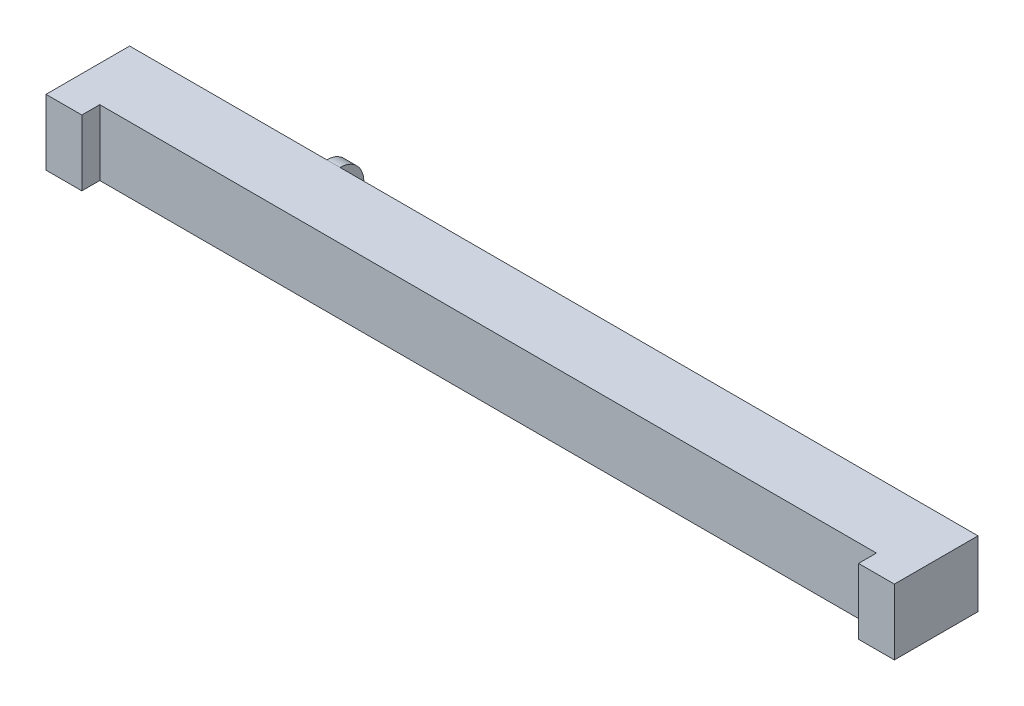
ISO-10303-21;
HEADER;
FILE_DESCRIPTION(('STEP AP214'),'2;1');
FILE_NAME('part.step','',(''),(''),'','','');
FILE_SCHEMA(('AUTOMOTIVE_DESIGN { 1 0 10303 214 1 1 1 1 }'));
ENDSEC;
DATA;
#1=APPLICATION_CONTEXT('core data for automotive mechanical design processes');
#2=APPLICATION_PROTOCOL_DEFINITION('international standard','automotive_design',2000,#1);
#3=PRODUCT_CONTEXT('',#1,'mechanical');
#4=PRODUCT('Part','Part','',(#3));
#5=PRODUCT_RELATED_PRODUCT_CATEGORY('part','',(#4));
#6=PRODUCT_DEFINITION_FORMATION('','',#4);
#7=PRODUCT_DEFINITION_CONTEXT('part definition',#1,'design');
#8=PRODUCT_DEFINITION('design','',#6,#7);
#9=PRODUCT_DEFINITION_SHAPE('','',#8);
#10=(LENGTH_UNIT() NAMED_UNIT(*) SI_UNIT(.MILLI.,.METRE.));
#11=(NAMED_UNIT(*) PLANE_ANGLE_UNIT() SI_UNIT($,.RADIAN.));
#12=(NAMED_UNIT(*) SI_UNIT($,.STERADIAN.) SOLID_ANGLE_UNIT());
#13=UNCERTAINTY_MEASURE_WITH_UNIT(LENGTH_MEASURE(1.E-05),#10,'distance_accuracy_value','');
#14=(GEOMETRIC_REPRESENTATION_CONTEXT(3) GLOBAL_UNCERTAINTY_ASSIGNED_CONTEXT((#13)) GLOBAL_UNIT_ASSIGNED_CONTEXT((#10,
#11,#12)) REPRESENTATION_CONTEXT('',''));
#15=CARTESIAN_POINT('',(0.,0.,0.));
#16=DIRECTION('',(0.,0.,1.));
#17=DIRECTION('',(1.,0.,0.));
#18=AXIS2_PLACEMENT_3D('',#15,#16,#17);
#19=CARTESIAN_POINT('',(-31.5,-63.0317380372777,-3.5));
#20=DIRECTION('',(-1.,0.,0.));
#21=DIRECTION('',(0.,0.,1.));
#22=AXIS2_PLACEMENT_3D('',#19,#20,#21);
#23=PLANE('',#22);
#24=DIRECTION('',(0.,1.,0.));
#25=VECTOR('',#24,1.);
#26=CARTESIAN_POINT('',(-31.5,-63.0317380372777,-3.5));
#27=LINE('',#26,#25);
#28=CARTESIAN_POINT('',(-31.5,0.,-3.5));
#29=VERTEX_POINT('',#28);
#30=CARTESIAN_POINT('',(-31.5,2.6,-3.5));
#31=VERTEX_POINT('',#30);
#32=EDGE_CURVE('E250',#29,#31,#27,.T.);
#33=ORIENTED_EDGE('',*,*,#32,.T.);
#34=DIRECTION('',(0.,0.,1.));
#35=VECTOR('',#34,1.);
#36=CARTESIAN_POINT('',(-31.5,2.6,-5.5));
#37=LINE('',#36,#35);
#38=CARTESIAN_POINT('',(-31.5,2.6,-5.5));
#39=VERTEX_POINT('',#38);
#40=EDGE_CURVE('E384',#39,#31,#37,.T.);
#41=ORIENTED_EDGE('',*,*,#40,.F.);
#42=DIRECTION('',(0.,1.,0.));
#43=VECTOR('',#42,1.);
#44=CARTESIAN_POINT('',(-31.5,-63.0317380372777,-5.5));
#45=LINE('',#44,#43);
#46=CARTESIAN_POINT('',(-31.5,0.,-5.5));
#47=VERTEX_POINT('',#46);
#48=EDGE_CURVE('E376',#47,#39,#45,.T.);
#49=ORIENTED_EDGE('',*,*,#48,.F.);
#50=DIRECTION('',(0.,0.,-1.));
#51=VECTOR('',#50,1.);
#52=CARTESIAN_POINT('',(-31.5,0.,-3.5));
#53=LINE('',#52,#51);
#54=EDGE_CURVE('E249',#29,#47,#53,.T.);
#55=ORIENTED_EDGE('',*,*,#54,.F.);
#56=EDGE_LOOP('',(#33,#41,#49,#55));
#57=FACE_BOUND('',#56,.T.);
#58=ADVANCED_FACE('F43',(#57),#23,.T.);
#59=CARTESIAN_POINT('',(-35.5,5.5,-3.5));
#60=DIRECTION('',(0.,0.,1.));
#61=DIRECTION('',(1.,0.,0.));
#62=AXIS2_PLACEMENT_3D('',#59,#60,#61);
#63=PLANE('',#62);
#64=DIRECTION('',(0.,1.,0.));
#65=VECTOR('',#64,1.);
#66=CARTESIAN_POINT('',(-34.670728733258,4.93410987982223,-3.5));
#67=LINE('',#66,#65);
#68=CARTESIAN_POINT('',(-34.670728733258,3.13346972287778,-3.5));
#69=VERTEX_POINT('',#68);
#70=CARTESIAN_POINT('',(-34.670728733258,4.93410987982223,-3.5));
#71=VERTEX_POINT('',#70);
#72=EDGE_CURVE('E690',#69,#71,#67,.T.);
#73=ORIENTED_EDGE('',*,*,#72,.F.);
#74=DIRECTION('',(-1.,0.,0.));
#75=VECTOR('',#74,1.);
#76=CARTESIAN_POINT('',(-34.670728733258,3.13346972287778,-3.5));
#77=LINE('',#76,#75);
#78=CARTESIAN_POINT('',(-19.,3.13346972287778,-3.5));
#79=VERTEX_POINT('',#78);
#80=EDGE_CURVE('E697',#79,#69,#77,.T.);
#81=ORIENTED_EDGE('',*,*,#80,.F.);
#82=DIRECTION('',(0.,1.,0.));
#83=VECTOR('',#82,1.);
#84=CARTESIAN_POINT('',(-19.,2.6,-3.5));
#85=LINE('',#84,#83);
#86=CARTESIAN_POINT('',(-19.,2.6,-3.5));
#87=VERTEX_POINT('',#86);
#88=EDGE_CURVE('E389',#87,#79,#85,.T.);
#89=ORIENTED_EDGE('',*,*,#88,.F.);
#90=DIRECTION('',(1.,0.,0.));
#91=VECTOR('',#90,1.);
#92=CARTESIAN_POINT('',(-31.5,2.6,-3.5));
#93=LINE('',#92,#91);
#94=EDGE_CURVE('E386',#31,#87,#93,.T.);
#95=ORIENTED_EDGE('',*,*,#94,.F.);
#96=ORIENTED_EDGE('',*,*,#32,.F.);
#97=DIRECTION('',(-1.,0.,0.));
#98=VECTOR('',#97,1.);
#99=CARTESIAN_POINT('',(-35.5,0.,-3.5));
#100=LINE('',#99,#98);
#101=CARTESIAN_POINT('',(-35.5,0.,-3.5));
#102=VERTEX_POINT('',#101);
#103=EDGE_CURVE('E312',#29,#102,#100,.T.);
#104=ORIENTED_EDGE('',*,*,#103,.T.);
#105=DIRECTION('',(0.,-1.,0.));
#106=VECTOR('',#105,1.);
#107=CARTESIAN_POINT('',(-35.5,5.5,-3.5));
#108=LINE('',#107,#106);
#109=CARTESIAN_POINT('',(-35.5,5.5,-3.5));
#110=VERTEX_POINT('',#109);
#111=EDGE_CURVE('E287',#110,#102,#108,.T.);
#112=ORIENTED_EDGE('',*,*,#111,.F.);
#113=DIRECTION('',(-1.,0.,0.));
#114=VECTOR('',#113,1.);
#115=CARTESIAN_POINT('',(-35.5,5.5,-3.5));
#116=LINE('',#115,#114);
#117=CARTESIAN_POINT('',(-19.,5.5,-3.5));
#118=VERTEX_POINT('',#117);
#119=EDGE_CURVE('E277',#118,#110,#116,.T.);
#120=ORIENTED_EDGE('',*,*,#119,.F.);
#121=CARTESIAN_POINT('',(-19.,4.93410987982222,-3.5));
#122=VERTEX_POINT('',#121);
#123=EDGE_CURVE('E284',#122,#118,#85,.T.);
#124=ORIENTED_EDGE('',*,*,#123,.F.);
#125=DIRECTION('',(1.,0.,0.));
#126=VECTOR('',#125,1.);
#127=CARTESIAN_POINT('',(-34.670728733258,4.93410987982223,-3.5));
#128=LINE('',#127,#126);
#129=EDGE_CURVE('E66',#71,#122,#128,.T.);
#130=ORIENTED_EDGE('',*,*,#129,.F.);
#131=EDGE_LOOP('',(#73,#81,#89,#95,#96,#104,#112,#120,#124,#130));
#132=FACE_BOUND('',#131,.T.);
#133=ADVANCED_FACE('F283',(#132),#63,.F.);
#134=CARTESIAN_POINT('',(-35.5,5.5,3.5));
#135=DIRECTION('',(0.,0.,-1.));
#136=DIRECTION('',(-1.,0.,0.));
#137=AXIS2_PLACEMENT_3D('',#134,#135,#136);
#138=PLANE('',#137);
#139=DIRECTION('',(1.,0.,0.));
#140=VECTOR('',#139,1.);
#141=CARTESIAN_POINT('',(-35.5,5.5,3.5));
#142=LINE('',#141,#140);
#143=CARTESIAN_POINT('',(32.5,5.5,3.5));
#144=VERTEX_POINT('',#143);
#145=CARTESIAN_POINT('',(35.5,5.5,3.5));
#146=VERTEX_POINT('',#145);
#147=EDGE_CURVE('E354',#144,#146,#142,.T.);
#148=ORIENTED_EDGE('',*,*,#147,.F.);
#149=DIRECTION('',(0.,-1.,0.));
#150=VECTOR('',#149,1.);
#151=CARTESIAN_POINT('',(32.5,5.5,3.5));
#152=LINE('',#151,#150);
#153=CARTESIAN_POINT('',(32.5,0.,3.5));
#154=VERTEX_POINT('',#153);
#155=EDGE_CURVE('E306',#144,#154,#152,.T.);
#156=ORIENTED_EDGE('',*,*,#155,.T.);
#157=DIRECTION('',(1.,0.,0.));
#158=VECTOR('',#157,1.);
#159=CARTESIAN_POINT('',(-35.5,0.,3.5));
#160=LINE('',#159,#158);
#161=CARTESIAN_POINT('',(35.5,0.,3.5));
#162=VERTEX_POINT('',#161);
#163=EDGE_CURVE('E305',#154,#162,#160,.T.);
#164=ORIENTED_EDGE('',*,*,#163,.T.);
#165=DIRECTION('',(0.,-1.,0.));
#166=VECTOR('',#165,1.);
#167=CARTESIAN_POINT('',(35.5,5.5,3.5));
#168=LINE('',#167,#166);
#169=EDGE_CURVE('E332',#146,#162,#168,.T.);
#170=ORIENTED_EDGE('',*,*,#169,.F.);
#171=EDGE_LOOP('',(#148,#156,#164,#170));
#172=FACE_BOUND('',#171,.T.);
#173=ADVANCED_FACE('F430',(#172),#138,.F.);
#174=CARTESIAN_POINT('',(-35.5,5.5,-3.5));
#175=DIRECTION('',(1.,0.,0.));
#176=DIRECTION('',(0.,0.,-1.));
#177=AXIS2_PLACEMENT_3D('',#174,#175,#176);
#178=PLANE('',#177);
#179=DIRECTION('',(0.,0.,1.));
#180=VECTOR('',#179,1.);
#181=CARTESIAN_POINT('',(-35.5,0.,-3.5));
#182=LINE('',#181,#180);
#183=CARTESIAN_POINT('',(-35.5,0.,3.5));
#184=VERTEX_POINT('',#183);
#185=EDGE_CURVE('E301',#102,#184,#182,.T.);
#186=ORIENTED_EDGE('',*,*,#185,.T.);
#187=DIRECTION('',(0.,-1.,0.));
#188=VECTOR('',#187,1.);
#189=CARTESIAN_POINT('',(-35.5,5.5,3.5));
#190=LINE('',#189,#188);
#191=CARTESIAN_POINT('',(-35.5,5.5,3.5));
#192=VERTEX_POINT('',#191);
#193=EDGE_CURVE('E329',#192,#184,#190,.T.);
#194=ORIENTED_EDGE('',*,*,#193,.F.);
#195=DIRECTION('',(0.,0.,1.));
#196=VECTOR('',#195,1.);
#197=CARTESIAN_POINT('',(-35.5,5.5,-3.5));
#198=LINE('',#197,#196);
#199=EDGE_CURVE('E320',#110,#192,#198,.T.);
#200=ORIENTED_EDGE('',*,*,#199,.F.);
#201=ORIENTED_EDGE('',*,*,#111,.T.);
#202=EDGE_LOOP('',(#186,#194,#200,#201));
#203=FACE_BOUND('',#202,.T.);
#204=ADVANCED_FACE('F340',(#203),#178,.F.);
#205=CARTESIAN_POINT('',(-32.5,0.,3.5));
#206=VERTEX_POINT('',#205);
#207=EDGE_CURVE('E307',#184,#206,#160,.T.);
#208=ORIENTED_EDGE('',*,*,#207,.T.);
#209=DIRECTION('',(0.,1.,0.));
#210=VECTOR('',#209,1.);
#211=CARTESIAN_POINT('',(-32.5,5.5,3.5));
#212=LINE('',#211,#210);
#213=CARTESIAN_POINT('',(-32.5,5.5,3.5));
#214=VERTEX_POINT('',#213);
#215=EDGE_CURVE('E352',#206,#214,#212,.T.);
#216=ORIENTED_EDGE('',*,*,#215,.T.);
#217=EDGE_CURVE('E292',#192,#214,#142,.T.);
#218=ORIENTED_EDGE('',*,*,#217,.F.);
#219=ORIENTED_EDGE('',*,*,#193,.T.);
#220=EDGE_LOOP('',(#208,#216,#218,#219));
#221=FACE_BOUND('',#220,.T.);
#222=ADVANCED_FACE('F350',(#221),#138,.F.);
#223=CARTESIAN_POINT('',(35.5,5.5,-3.5));
#224=DIRECTION('',(-1.,0.,0.));
#225=DIRECTION('',(0.,0.,1.));
#226=AXIS2_PLACEMENT_3D('',#223,#224,#225);
#227=PLANE('',#226);
#228=DIRECTION('',(0.,0.,-1.));
#229=VECTOR('',#228,1.);
#230=CARTESIAN_POINT('',(35.5,0.,-3.5));
#231=LINE('',#230,#229);
#232=CARTESIAN_POINT('',(35.5,0.,-3.5));
#233=VERTEX_POINT('',#232);
#234=EDGE_CURVE('E310',#162,#233,#231,.T.);
#235=ORIENTED_EDGE('',*,*,#234,.T.);
#236=DIRECTION('',(0.,-1.,0.));
#237=VECTOR('',#236,1.);
#238=CARTESIAN_POINT('',(35.5,5.5,-3.5));
#239=LINE('',#238,#237);
#240=CARTESIAN_POINT('',(35.5,5.5,-3.5));
#241=VERTEX_POINT('',#240);
#242=EDGE_CURVE('E334',#241,#233,#239,.T.);
#243=ORIENTED_EDGE('',*,*,#242,.F.);
#244=DIRECTION('',(0.,0.,-1.));
#245=VECTOR('',#244,1.);
#246=CARTESIAN_POINT('',(35.5,5.5,-3.5));
#247=LINE('',#246,#245);
#248=EDGE_CURVE('E289',#146,#241,#247,.T.);
#249=ORIENTED_EDGE('',*,*,#248,.F.);
#250=ORIENTED_EDGE('',*,*,#169,.T.);
#251=EDGE_LOOP('',(#235,#243,#249,#250));
#252=FACE_BOUND('',#251,.T.);
#253=ADVANCED_FACE('F425',(#252),#227,.F.);
#254=DIRECTION('',(0.,1.,0.));
#255=VECTOR('',#254,1.);
#256=CARTESIAN_POINT('',(-17.9,2.6,-3.5));
#257=LINE('',#256,#255);
#258=CARTESIAN_POINT('',(-17.9,2.6,-3.5));
#259=VERTEX_POINT('',#258);
#260=CARTESIAN_POINT('',(-17.9,3.13346972287778,-3.5));
#261=VERTEX_POINT('',#260);
#262=EDGE_CURVE('E231',#259,#261,#257,.T.);
#263=ORIENTED_EDGE('',*,*,#262,.T.);
#264=DIRECTION('',(-1.,0.,0.));
#265=VECTOR('',#264,1.);
#266=CARTESIAN_POINT('',(-17.9,3.13346972287779,-3.5));
#267=LINE('',#266,#265);
#268=CARTESIAN_POINT('',(34.747146170088,3.13346972287778,-3.5));
#269=VERTEX_POINT('',#268);
#270=EDGE_CURVE('E58',#269,#261,#267,.T.);
#271=ORIENTED_EDGE('',*,*,#270,.F.);
#272=DIRECTION('',(0.,-1.,0.));
#273=VECTOR('',#272,1.);
#274=CARTESIAN_POINT('',(34.747146170088,4.93410987982223,-3.5));
#275=LINE('',#274,#273);
#276=CARTESIAN_POINT('',(34.747146170088,4.93410987982223,-3.5));
#277=VERTEX_POINT('',#276);
#278=EDGE_CURVE('E225',#277,#269,#275,.T.);
#279=ORIENTED_EDGE('',*,*,#278,.F.);
#280=DIRECTION('',(1.,0.,0.));
#281=VECTOR('',#280,1.);
#282=CARTESIAN_POINT('',(-17.9,4.93410987982223,-3.5));
#283=LINE('',#282,#281);
#284=CARTESIAN_POINT('',(-17.9,4.93410987982223,-3.5));
#285=VERTEX_POINT('',#284);
#286=EDGE_CURVE('E204',#285,#277,#283,.T.);
#287=ORIENTED_EDGE('',*,*,#286,.F.);
#288=CARTESIAN_POINT('',(-17.9,5.5,-3.5));
#289=VERTEX_POINT('',#288);
#290=EDGE_CURVE('E223',#285,#289,#257,.T.);
#291=ORIENTED_EDGE('',*,*,#290,.T.);
#292=EDGE_CURVE('E279',#241,#289,#116,.T.);
#293=ORIENTED_EDGE('',*,*,#292,.F.);
#294=ORIENTED_EDGE('',*,*,#242,.T.);
#295=CARTESIAN_POINT('',(31.5,0.,-3.5));
#296=VERTEX_POINT('',#295);
#297=EDGE_CURVE('E318',#233,#296,#100,.T.);
#298=ORIENTED_EDGE('',*,*,#297,.T.);
#299=DIRECTION('',(0.,1.,0.));
#300=VECTOR('',#299,1.);
#301=CARTESIAN_POINT('',(31.5,-63.0317380372777,-3.5));
#302=LINE('',#301,#300);
#303=CARTESIAN_POINT('',(31.5,2.6,-3.5));
#304=VERTEX_POINT('',#303);
#305=EDGE_CURVE('E245',#296,#304,#302,.T.);
#306=ORIENTED_EDGE('',*,*,#305,.T.);
#307=DIRECTION('',(1.,0.,0.));
#308=VECTOR('',#307,1.);
#309=CARTESIAN_POINT('',(31.5,2.6,-3.5));
#310=LINE('',#309,#308);
#311=EDGE_CURVE('E235',#259,#304,#310,.T.);
#312=ORIENTED_EDGE('',*,*,#311,.F.);
#313=EDGE_LOOP('',(#263,#271,#279,#287,#291,#293,#294,#298,#306,#312));
#314=FACE_BOUND('',#313,.T.);
#315=ADVANCED_FACE('F221',(#314),#63,.F.);
#316=CARTESIAN_POINT('',(-35.5,5.5,3.5));
#317=DIRECTION('',(0.,1.,0.));
#318=DIRECTION('',(0.,0.,1.));
#319=AXIS2_PLACEMENT_3D('',#316,#317,#318);
#320=PLANE('',#319);
#321=ORIENTED_EDGE('',*,*,#292,.T.);
#322=DIRECTION('',(-1.,0.,0.));
#323=VECTOR('',#322,1.);
#324=CARTESIAN_POINT('',(-35.5,5.5,-3.5));
#325=LINE('',#324,#323);
#326=EDGE_CURVE('E253',#289,#118,#325,.T.);
#327=ORIENTED_EDGE('',*,*,#326,.T.);
#328=ORIENTED_EDGE('',*,*,#119,.T.);
#329=ORIENTED_EDGE('',*,*,#199,.T.);
#330=ORIENTED_EDGE('',*,*,#217,.T.);
#331=DIRECTION('',(0.,0.,1.));
#332=VECTOR('',#331,1.);
#333=CARTESIAN_POINT('',(-32.5,5.5,4.76632018269155));
#334=LINE('',#333,#332);
#335=CARTESIAN_POINT('',(-32.5,5.5,2.));
#336=VERTEX_POINT('',#335);
#337=EDGE_CURVE('E364',#336,#214,#334,.T.);
#338=ORIENTED_EDGE('',*,*,#337,.F.);
#339=DIRECTION('',(-1.,0.,0.));
#340=VECTOR('',#339,1.);
#341=CARTESIAN_POINT('',(32.5,5.5,2.));
#342=LINE('',#341,#340);
#343=CARTESIAN_POINT('',(32.5,5.5,2.));
#344=VERTEX_POINT('',#343);
#345=EDGE_CURVE('E367',#344,#336,#342,.T.);
#346=ORIENTED_EDGE('',*,*,#345,.F.);
#347=DIRECTION('',(0.,0.,-1.));
#348=VECTOR('',#347,1.);
#349=CARTESIAN_POINT('',(32.5,5.5,4.76632018269155));
#350=LINE('',#349,#348);
#351=EDGE_CURVE('E370',#144,#344,#350,.T.);
#352=ORIENTED_EDGE('',*,*,#351,.F.);
#353=ORIENTED_EDGE('',*,*,#147,.T.);
#354=ORIENTED_EDGE('',*,*,#248,.T.);
#355=EDGE_LOOP('',(#321,#327,#328,#329,#330,#338,#346,#352,#353,#354));
#356=FACE_BOUND('',#355,.T.);
#357=ADVANCED_FACE('F275',(#356),#320,.T.);
#358=CARTESIAN_POINT('',(-35.5,0.,3.5));
#359=DIRECTION('',(0.,1.,0.));
#360=DIRECTION('',(0.,0.,1.));
#361=AXIS2_PLACEMENT_3D('',#358,#359,#360);
#362=PLANE('',#361);
#363=ORIENTED_EDGE('',*,*,#163,.F.);
#364=DIRECTION('',(0.,0.,-1.));
#365=VECTOR('',#364,1.);
#366=CARTESIAN_POINT('',(32.5,0.,3.5));
#367=LINE('',#366,#365);
#368=CARTESIAN_POINT('',(32.5,0.,2.));
#369=VERTEX_POINT('',#368);
#370=EDGE_CURVE('E257',#154,#369,#367,.T.);
#371=ORIENTED_EDGE('',*,*,#370,.T.);
#372=DIRECTION('',(-1.,0.,0.));
#373=VECTOR('',#372,1.);
#374=CARTESIAN_POINT('',(-35.5,0.,2.));
#375=LINE('',#374,#373);
#376=CARTESIAN_POINT('',(-32.5,0.,2.));
#377=VERTEX_POINT('',#376);
#378=EDGE_CURVE('E326',#369,#377,#375,.T.);
#379=ORIENTED_EDGE('',*,*,#378,.T.);
#380=DIRECTION('',(0.,0.,1.));
#381=VECTOR('',#380,1.);
#382=CARTESIAN_POINT('',(-32.5,0.,3.5));
#383=LINE('',#382,#381);
#384=EDGE_CURVE('E323',#377,#206,#383,.T.);
#385=ORIENTED_EDGE('',*,*,#384,.T.);
#386=ORIENTED_EDGE('',*,*,#207,.F.);
#387=ORIENTED_EDGE('',*,*,#185,.F.);
#388=ORIENTED_EDGE('',*,*,#103,.F.);
#389=ORIENTED_EDGE('',*,*,#54,.T.);
#390=DIRECTION('',(1.,0.,0.));
#391=VECTOR('',#390,1.);
#392=CARTESIAN_POINT('',(31.5,0.,-5.5));
#393=LINE('',#392,#391);
#394=CARTESIAN_POINT('',(31.5,0.,-5.5));
#395=VERTEX_POINT('',#394);
#396=EDGE_CURVE('E372',#47,#395,#393,.T.);
#397=ORIENTED_EDGE('',*,*,#396,.T.);
#398=DIRECTION('',(0.,0.,1.));
#399=VECTOR('',#398,1.);
#400=CARTESIAN_POINT('',(31.5,0.,-3.5));
#401=LINE('',#400,#399);
#402=EDGE_CURVE('E374',#395,#296,#401,.T.);
#403=ORIENTED_EDGE('',*,*,#402,.T.);
#404=ORIENTED_EDGE('',*,*,#297,.F.);
#405=ORIENTED_EDGE('',*,*,#234,.F.);
#406=EDGE_LOOP('',(#363,#371,#379,#385,#386,#387,#388,#389,#397,#403,#404,#405));
#407=FACE_BOUND('',#406,.T.);
#408=ADVANCED_FACE('F345',(#407),#362,.F.);
#409=CARTESIAN_POINT('',(32.5,-2.,4.76632018269155));
#410=DIRECTION('',(1.,0.,0.));
#411=DIRECTION('',(0.,0.,-1.));
#412=AXIS2_PLACEMENT_3D('',#409,#410,#411);
#413=PLANE('',#412);
#414=ORIENTED_EDGE('',*,*,#351,.T.);
#415=DIRECTION('',(0.,1.,0.));
#416=VECTOR('',#415,1.);
#417=CARTESIAN_POINT('',(32.5,-2.,2.));
#418=LINE('',#417,#416);
#419=EDGE_CURVE('E361',#369,#344,#418,.T.);
#420=ORIENTED_EDGE('',*,*,#419,.F.);
#421=ORIENTED_EDGE('',*,*,#370,.F.);
#422=ORIENTED_EDGE('',*,*,#155,.F.);
#423=EDGE_LOOP('',(#414,#420,#421,#422));
#424=FACE_BOUND('',#423,.T.);
#425=ADVANCED_FACE('F433',(#424),#413,.F.);
#426=CARTESIAN_POINT('',(-32.5,-2.,4.76632018269155));
#427=DIRECTION('',(-1.,0.,0.));
#428=DIRECTION('',(0.,0.,1.));
#429=AXIS2_PLACEMENT_3D('',#426,#427,#428);
#430=PLANE('',#429);
#431=ORIENTED_EDGE('',*,*,#384,.F.);
#432=DIRECTION('',(0.,1.,0.));
#433=VECTOR('',#432,1.);
#434=CARTESIAN_POINT('',(-32.5,-2.,2.));
#435=LINE('',#434,#433);
#436=EDGE_CURVE('E360',#377,#336,#435,.T.);
#437=ORIENTED_EDGE('',*,*,#436,.T.);
#438=ORIENTED_EDGE('',*,*,#337,.T.);
#439=ORIENTED_EDGE('',*,*,#215,.F.);
#440=EDGE_LOOP('',(#431,#437,#438,#439));
#441=FACE_BOUND('',#440,.T.);
#442=ADVANCED_FACE('F439',(#441),#430,.F.);
#443=CARTESIAN_POINT('',(32.5,-2.,2.));
#444=DIRECTION('',(0.,0.,-1.));
#445=DIRECTION('',(-1.,0.,0.));
#446=AXIS2_PLACEMENT_3D('',#443,#444,#445);
#447=PLANE('',#446);
#448=ORIENTED_EDGE('',*,*,#419,.T.);
#449=ORIENTED_EDGE('',*,*,#345,.T.);
#450=ORIENTED_EDGE('',*,*,#436,.F.);
#451=ORIENTED_EDGE('',*,*,#378,.F.);
#452=EDGE_LOOP('',(#448,#449,#450,#451));
#453=FACE_BOUND('',#452,.T.);
#454=ADVANCED_FACE('F437',(#453),#447,.F.);
#455=CARTESIAN_POINT('',(31.5,-63.0317380372777,-3.5));
#456=DIRECTION('',(1.,0.,0.));
#457=DIRECTION('',(0.,0.,-1.));
#458=AXIS2_PLACEMENT_3D('',#455,#456,#457);
#459=PLANE('',#458);
#460=DIRECTION('',(0.,0.,-1.));
#461=VECTOR('',#460,1.);
#462=CARTESIAN_POINT('',(31.5,2.6,-5.5));
#463=LINE('',#462,#461);
#464=CARTESIAN_POINT('',(31.5,2.6,-5.5));
#465=VERTEX_POINT('',#464);
#466=EDGE_CURVE('E407',#304,#465,#463,.T.);
#467=ORIENTED_EDGE('',*,*,#466,.F.);
#468=ORIENTED_EDGE('',*,*,#305,.F.);
#469=ORIENTED_EDGE('',*,*,#402,.F.);
#470=DIRECTION('',(0.,1.,0.));
#471=VECTOR('',#470,1.);
#472=CARTESIAN_POINT('',(31.5,-63.0317380372777,-5.5));
#473=LINE('',#472,#471);
#474=EDGE_CURVE('E234',#395,#465,#473,.T.);
#475=ORIENTED_EDGE('',*,*,#474,.T.);
#476=EDGE_LOOP('',(#467,#468,#469,#475));
#477=FACE_BOUND('',#476,.T.);
#478=ADVANCED_FACE('F417',(#477),#459,.T.);
#479=CARTESIAN_POINT('',(31.5,-63.0317380372777,-5.5));
#480=DIRECTION('',(0.,0.,-1.));
#481=DIRECTION('',(-1.,0.,0.));
#482=AXIS2_PLACEMENT_3D('',#479,#480,#481);
#483=PLANE('',#482);
#484=DIRECTION('',(0.,1.,0.));
#485=VECTOR('',#484,1.);
#486=CARTESIAN_POINT('',(-19.,2.6,-5.5));
#487=LINE('',#486,#485);
#488=CARTESIAN_POINT('',(-19.,2.6,-5.5));
#489=VERTEX_POINT('',#488);
#490=CARTESIAN_POINT('',(-19.,3.5,-5.5));
#491=VERTEX_POINT('',#490);
#492=EDGE_CURVE('E266',#489,#491,#487,.T.);
#493=ORIENTED_EDGE('',*,*,#492,.T.);
#494=DIRECTION('',(-1.,0.,0.));
#495=VECTOR('',#494,1.);
#496=CARTESIAN_POINT('',(31.5,3.5,-5.5));
#497=LINE('',#496,#495);
#498=CARTESIAN_POINT('',(-17.9,3.5,-5.5));
#499=VERTEX_POINT('',#498);
#500=EDGE_CURVE('E51',#491,#499,#497,.F.);
#501=ORIENTED_EDGE('',*,*,#500,.T.);
#502=DIRECTION('',(0.,1.,0.));
#503=VECTOR('',#502,1.);
#504=CARTESIAN_POINT('',(-17.9,2.6,-5.5));
#505=LINE('',#504,#503);
#506=CARTESIAN_POINT('',(-17.9,2.6,-5.5));
#507=VERTEX_POINT('',#506);
#508=EDGE_CURVE('E232',#507,#499,#505,.T.);
#509=ORIENTED_EDGE('',*,*,#508,.F.);
#510=DIRECTION('',(-1.,0.,0.));
#511=VECTOR('',#510,1.);
#512=CARTESIAN_POINT('',(31.5,2.6,-5.5));
#513=LINE('',#512,#511);
#514=EDGE_CURVE('E410',#465,#507,#513,.T.);
#515=ORIENTED_EDGE('',*,*,#514,.F.);
#516=ORIENTED_EDGE('',*,*,#474,.F.);
#517=ORIENTED_EDGE('',*,*,#396,.F.);
#518=ORIENTED_EDGE('',*,*,#48,.T.);
#519=DIRECTION('',(-1.,0.,0.));
#520=VECTOR('',#519,1.);
#521=CARTESIAN_POINT('',(-31.5,2.6,-5.5));
#522=LINE('',#521,#520);
#523=EDGE_CURVE('E395',#489,#39,#522,.T.);
#524=ORIENTED_EDGE('',*,*,#523,.F.);
#525=EDGE_LOOP('',(#493,#501,#509,#515,#516,#517,#518,#524));
#526=FACE_BOUND('',#525,.T.);
#527=ADVANCED_FACE('F262',(#526),#483,.T.);
#528=CARTESIAN_POINT('',(-17.9,2.6,-5.5));
#529=DIRECTION('',(-1.,0.,0.));
#530=DIRECTION('',(0.,0.,1.));
#531=AXIS2_PLACEMENT_3D('',#528,#529,#530);
#532=PLANE('',#531);
#533=ORIENTED_EDGE('',*,*,#508,.T.);
#534=CARTESIAN_POINT('',(-17.9,3.5,-3.5));
#535=DIRECTION('',(-1.,0.,0.));
#536=DIRECTION('',(0.,0.,1.));
#537=AXIS2_PLACEMENT_3D('',#534,#535,#536);
#538=CIRCLE('',#537,2.);
#539=EDGE_CURVE('E11',#499,#289,#538,.F.);
#540=ORIENTED_EDGE('',*,*,#539,.T.);
#541=ORIENTED_EDGE('',*,*,#290,.F.);
#542=DIRECTION('',(0.,1.,0.));
#543=VECTOR('',#542,1.);
#544=CARTESIAN_POINT('',(-17.9,4.93410987982223,-3.5));
#545=LINE('',#544,#543);
#546=EDGE_CURVE('E213',#261,#285,#545,.T.);
#547=ORIENTED_EDGE('',*,*,#546,.F.);
#548=ORIENTED_EDGE('',*,*,#262,.F.);
#549=DIRECTION('',(0.,0.,1.));
#550=VECTOR('',#549,1.);
#551=CARTESIAN_POINT('',(-17.9,2.6,-5.5));
#552=LINE('',#551,#550);
#553=EDGE_CURVE('E270',#507,#259,#552,.T.);
#554=ORIENTED_EDGE('',*,*,#553,.F.);
#555=EDGE_LOOP('',(#533,#540,#541,#547,#548,#554));
#556=FACE_BOUND('',#555,.T.);
#557=ADVANCED_FACE('F228',(#556),#532,.F.);
#558=CARTESIAN_POINT('',(31.5,2.6,-3.5));
#559=DIRECTION('',(0.,-1.,0.));
#560=DIRECTION('',(0.,0.,-1.));
#561=AXIS2_PLACEMENT_3D('',#558,#559,#560);
#562=PLANE('',#561);
#563=ORIENTED_EDGE('',*,*,#466,.T.);
#564=ORIENTED_EDGE('',*,*,#514,.T.);
#565=ORIENTED_EDGE('',*,*,#553,.T.);
#566=ORIENTED_EDGE('',*,*,#311,.T.);
#567=EDGE_LOOP('',(#563,#564,#565,#566));
#568=FACE_BOUND('',#567,.T.);
#569=ADVANCED_FACE('F414',(#568),#562,.F.);
#570=CARTESIAN_POINT('',(-19.,2.6,-5.5));
#571=DIRECTION('',(1.,0.,0.));
#572=DIRECTION('',(0.,0.,-1.));
#573=AXIS2_PLACEMENT_3D('',#570,#571,#572);
#574=PLANE('',#573);
#575=ORIENTED_EDGE('',*,*,#88,.T.);
#576=DIRECTION('',(0.,-1.,0.));
#577=VECTOR('',#576,1.);
#578=CARTESIAN_POINT('',(-19.,4.93410987982223,-3.5));
#579=LINE('',#578,#577);
#580=EDGE_CURVE('E694',#122,#79,#579,.T.);
#581=ORIENTED_EDGE('',*,*,#580,.F.);
#582=ORIENTED_EDGE('',*,*,#123,.T.);
#583=CARTESIAN_POINT('',(-19.,3.5,-3.5));
#584=DIRECTION('',(1.,0.,0.));
#585=DIRECTION('',(0.,0.,-1.));
#586=AXIS2_PLACEMENT_3D('',#583,#584,#585);
#587=CIRCLE('',#586,2.);
#588=EDGE_CURVE('E256',#118,#491,#587,.F.);
#589=ORIENTED_EDGE('',*,*,#588,.T.);
#590=ORIENTED_EDGE('',*,*,#492,.F.);
#591=DIRECTION('',(0.,0.,-1.));
#592=VECTOR('',#591,1.);
#593=CARTESIAN_POINT('',(-19.,2.6,-5.5));
#594=LINE('',#593,#592);
#595=EDGE_CURVE('E392',#87,#489,#594,.T.);
#596=ORIENTED_EDGE('',*,*,#595,.F.);
#597=EDGE_LOOP('',(#575,#581,#582,#589,#590,#596));
#598=FACE_BOUND('',#597,.T.);
#599=ADVANCED_FACE('F476',(#598),#574,.F.);
#600=CARTESIAN_POINT('',(-31.5,2.6,-5.5));
#601=DIRECTION('',(0.,1.,0.));
#602=DIRECTION('',(0.,0.,1.));
#603=AXIS2_PLACEMENT_3D('',#600,#601,#602);
#604=PLANE('',#603);
#605=ORIENTED_EDGE('',*,*,#40,.T.);
#606=ORIENTED_EDGE('',*,*,#94,.T.);
#607=ORIENTED_EDGE('',*,*,#595,.T.);
#608=ORIENTED_EDGE('',*,*,#523,.T.);
#609=EDGE_LOOP('',(#605,#606,#607,#608));
#610=FACE_BOUND('',#609,.T.);
#611=ADVANCED_FACE('F394',(#610),#604,.T.);
#612=CARTESIAN_POINT('',(-35.5,3.5,-3.5));
#613=DIRECTION('',(-1.,0.,0.));
#614=DIRECTION('',(0.,0.,1.));
#615=AXIS2_PLACEMENT_3D('',#612,#613,#614);
#616=CYLINDRICAL_SURFACE('',#615,2.);
#617=ORIENTED_EDGE('',*,*,#539,.F.);
#618=ORIENTED_EDGE('',*,*,#500,.F.);
#619=ORIENTED_EDGE('',*,*,#588,.F.);
#620=ORIENTED_EDGE('',*,*,#326,.F.);
#621=EDGE_LOOP('',(#617,#618,#619,#620));
#622=FACE_BOUND('',#621,.T.);
#623=ADVANCED_FACE('F45',(#622),#616,.T.);
#624=CARTESIAN_POINT('',(-34.670728733258,4.93410987982223,-3.5));
#625=DIRECTION('',(-0.980017280512655,0.,-0.198912367379658));
#626=DIRECTION('',(-0.198912367379658,0.,0.980017280512655));
#627=AXIS2_PLACEMENT_3D('',#624,#625,#626);
#628=PLANE('',#627);
#629=ORIENTED_EDGE('',*,*,#72,.T.);
#630=DIRECTION('',(0.198912367379658,0.,-0.980017280512655));
#631=VECTOR('',#630,1.);
#632=CARTESIAN_POINT('',(-34.670728733258,4.93410987982223,-3.5));
#633=LINE('',#632,#631);
#634=CARTESIAN_POINT('',(-35.2480266494242,4.93410987982223,-0.655722686830632));
#635=VERTEX_POINT('',#634);
#636=EDGE_CURVE('E701',#635,#71,#633,.T.);
#637=ORIENTED_EDGE('',*,*,#636,.F.);
#638=DIRECTION('',(0.,1.,0.));
#639=VECTOR('',#638,1.);
#640=CARTESIAN_POINT('',(-35.2480266494242,4.93410987982223,-0.655722686830632));
#641=LINE('',#640,#639);
#642=CARTESIAN_POINT('',(-35.2480266494242,1.95533148461292,-0.655722686830632));
#643=VERTEX_POINT('',#642);
#644=EDGE_CURVE('E699',#643,#635,#641,.T.);
#645=ORIENTED_EDGE('',*,*,#644,.F.);
#646=DIRECTION('',(0.18430580464304,0.376127662864532,-0.908052504871247));
#647=VECTOR('',#646,1.);
#648=CARTESIAN_POINT('',(-34.670728733258,3.13346972287778,-3.5));
#649=LINE('',#648,#647);
#650=EDGE_CURVE('E396',#643,#69,#649,.T.);
#651=ORIENTED_EDGE('',*,*,#650,.T.);
#652=EDGE_LOOP('',(#629,#637,#645,#651));
#653=FACE_BOUND('',#652,.T.);
#654=ADVANCED_FACE('F504',(#653),#628,.F.);
#655=CARTESIAN_POINT('',(-34.670728733258,3.13346972287778,-3.5));
#656=DIRECTION('',(0.,-0.923879532511287,-0.382683432365091));
#657=DIRECTION('',(0.,0.382683432365091,-0.923879532511287));
#658=AXIS2_PLACEMENT_3D('',#655,#656,#657);
#659=PLANE('',#658);
#660=DIRECTION('',(-0.18430580464304,0.376127662864532,-0.908052504871247));
#661=VECTOR('',#660,1.);
#662=CARTESIAN_POINT('',(-19.1248248980821,3.38820992096253,-4.1149972410978));
#663=LINE('',#662,#661);
#664=CARTESIAN_POINT('',(-18.45,2.01104053527756,-0.790216232492147));
#665=VERTEX_POINT('',#664);
#666=EDGE_CURVE('E398',#665,#79,#663,.T.);
#667=ORIENTED_EDGE('',*,*,#666,.T.);
#668=ORIENTED_EDGE('',*,*,#80,.T.);
#669=ORIENTED_EDGE('',*,*,#650,.F.);
#670=DIRECTION('',(-1.,0.,0.));
#671=VECTOR('',#670,1.);
#672=CARTESIAN_POINT('',(-34.670728733258,1.95533148461292,-0.655722686830632));
#673=LINE('',#672,#671);
#674=CARTESIAN_POINT('',(35.3244440862542,1.95533148461292,-0.655722686830632));
#675=VERTEX_POINT('',#674);
#676=EDGE_CURVE('E703',#675,#643,#673,.T.);
#677=ORIENTED_EDGE('',*,*,#676,.F.);
#678=DIRECTION('',(-0.18430580464304,0.376127662864532,-0.908052504871247));
#679=VECTOR('',#678,1.);
#680=CARTESIAN_POINT('',(34.6223212720059,3.38820992096253,-4.1149972410978));
#681=LINE('',#680,#679);
#682=EDGE_CURVE('E679',#675,#269,#681,.T.);
#683=ORIENTED_EDGE('',*,*,#682,.T.);
#684=ORIENTED_EDGE('',*,*,#270,.T.);
#685=DIRECTION('',(0.18430580464304,0.376127662864532,-0.908052504871247));
#686=VECTOR('',#685,1.);
#687=CARTESIAN_POINT('',(-17.9,3.13346972287779,-3.5));
#688=LINE('',#687,#686);
#689=EDGE_CURVE('E215',#665,#261,#688,.T.);
#690=ORIENTED_EDGE('',*,*,#689,.F.);
#691=EDGE_LOOP('',(#667,#668,#669,#677,#683,#684,#690));
#692=FACE_BOUND('',#691,.T.);
#693=ADVANCED_FACE('F535',(#692),#659,.F.);
#694=CARTESIAN_POINT('',(-19.,4.93410987982223,-3.5));
#695=DIRECTION('',(0.980017280512655,0.,-0.198912367379658));
#696=DIRECTION('',(-0.198912367379658,0.,-0.980017280512655));
#697=AXIS2_PLACEMENT_3D('',#694,#695,#696);
#698=PLANE('',#697);
#699=DIRECTION('',(0.,1.,0.));
#700=VECTOR('',#699,1.);
#701=CARTESIAN_POINT('',(-18.45,4.93410987982223,-0.790216232492139));
#702=LINE('',#701,#700);
#703=CARTESIAN_POINT('',(-18.45,4.93410987982223,-0.790216232492142));
#704=VERTEX_POINT('',#703);
#705=EDGE_CURVE('E685',#665,#704,#702,.T.);
#706=ORIENTED_EDGE('',*,*,#705,.T.);
#707=DIRECTION('',(-0.198912367379658,0.,-0.980017280512655));
#708=VECTOR('',#707,1.);
#709=CARTESIAN_POINT('',(-19.6200300886342,4.93410987982223,-6.55481358099511));
#710=LINE('',#709,#708);
#711=EDGE_CURVE('E206',#704,#122,#710,.T.);
#712=ORIENTED_EDGE('',*,*,#711,.T.);
#713=ORIENTED_EDGE('',*,*,#580,.T.);
#714=ORIENTED_EDGE('',*,*,#666,.F.);
#715=EDGE_LOOP('',(#706,#712,#713,#714));
#716=FACE_BOUND('',#715,.T.);
#717=ADVANCED_FACE('F545',(#716),#698,.F.);
#718=CARTESIAN_POINT('',(-34.670728733258,4.93410987982223,-3.5));
#719=DIRECTION('',(0.,1.,0.));
#720=DIRECTION('',(0.,0.,1.));
#721=AXIS2_PLACEMENT_3D('',#718,#719,#720);
#722=PLANE('',#721);
#723=DIRECTION('',(1.,0.,0.));
#724=VECTOR('',#723,1.);
#725=CARTESIAN_POINT('',(-34.670728733258,4.93410987982223,-0.655722686830632));
#726=LINE('',#725,#724);
#727=CARTESIAN_POINT('',(35.3244440862542,4.93410987982223,-0.655722686830632));
#728=VERTEX_POINT('',#727);
#729=EDGE_CURVE('E401',#635,#728,#726,.T.);
#730=ORIENTED_EDGE('',*,*,#729,.F.);
#731=ORIENTED_EDGE('',*,*,#636,.T.);
#732=ORIENTED_EDGE('',*,*,#129,.T.);
#733=ORIENTED_EDGE('',*,*,#711,.F.);
#734=DIRECTION('',(0.198912367379658,0.,-0.980017280512655));
#735=VECTOR('',#734,1.);
#736=CARTESIAN_POINT('',(-17.9,4.93410987982223,-3.5));
#737=LINE('',#736,#735);
#738=EDGE_CURVE('E198',#704,#285,#737,.T.);
#739=ORIENTED_EDGE('',*,*,#738,.T.);
#740=ORIENTED_EDGE('',*,*,#286,.T.);
#741=DIRECTION('',(-0.198912367379658,0.,-0.980017280512655));
#742=VECTOR('',#741,1.);
#743=CARTESIAN_POINT('',(32.6641023460381,4.93410987982222,-13.7629060753056));
#744=LINE('',#743,#742);
#745=EDGE_CURVE('E209',#728,#277,#744,.T.);
#746=ORIENTED_EDGE('',*,*,#745,.F.);
#747=EDGE_LOOP('',(#730,#731,#732,#733,#739,#740,#746));
#748=FACE_BOUND('',#747,.T.);
#749=ADVANCED_FACE('F201',(#748),#722,.F.);
#750=CARTESIAN_POINT('',(-34.670728733258,2.56770778903101,-0.655722686830632));
#751=DIRECTION('',(0.,0.,1.));
#752=DIRECTION('',(1.,0.,0.));
#753=AXIS2_PLACEMENT_3D('',#750,#751,#752);
#754=PLANE('',#753);
#755=ORIENTED_EDGE('',*,*,#644,.T.);
#756=ORIENTED_EDGE('',*,*,#729,.T.);
#757=DIRECTION('',(0.,-1.,0.));
#758=VECTOR('',#757,1.);
#759=CARTESIAN_POINT('',(35.3244440862542,4.93410987982223,-0.655722686830632));
#760=LINE('',#759,#758);
#761=EDGE_CURVE('E210',#728,#675,#760,.T.);
#762=ORIENTED_EDGE('',*,*,#761,.T.);
#763=ORIENTED_EDGE('',*,*,#676,.T.);
#764=EDGE_LOOP('',(#755,#756,#762,#763));
#765=FACE_BOUND('',#764,.T.);
#766=ADVANCED_FACE('F561',(#765),#754,.F.);
#767=CARTESIAN_POINT('',(-17.9,4.93410987982223,-3.5));
#768=DIRECTION('',(-0.980017280512655,0.,-0.198912367379658));
#769=DIRECTION('',(-0.198912367379658,0.,0.980017280512655));
#770=AXIS2_PLACEMENT_3D('',#767,#768,#769);
#771=PLANE('',#770);
#772=ORIENTED_EDGE('',*,*,#689,.T.);
#773=ORIENTED_EDGE('',*,*,#546,.T.);
#774=ORIENTED_EDGE('',*,*,#738,.F.);
#775=ORIENTED_EDGE('',*,*,#705,.F.);
#776=EDGE_LOOP('',(#772,#773,#774,#775));
#777=FACE_BOUND('',#776,.T.);
#778=ADVANCED_FACE('F214',(#777),#771,.F.);
#779=CARTESIAN_POINT('',(34.747146170088,4.93410987982223,-3.5));
#780=DIRECTION('',(0.980017280512655,0.,-0.198912367379658));
#781=DIRECTION('',(-0.198912367379658,0.,-0.980017280512655));
#782=AXIS2_PLACEMENT_3D('',#779,#780,#781);
#783=PLANE('',#782);
#784=ORIENTED_EDGE('',*,*,#278,.T.);
#785=ORIENTED_EDGE('',*,*,#682,.F.);
#786=ORIENTED_EDGE('',*,*,#761,.F.);
#787=ORIENTED_EDGE('',*,*,#745,.T.);
#788=EDGE_LOOP('',(#784,#785,#786,#787));
#789=FACE_BOUND('',#788,.T.);
#790=ADVANCED_FACE('F576',(#789),#783,.F.);
#791=CLOSED_SHELL('',(#58,#133,#173,#204,#222,#253,#315,#357,#408,#425,#442,#454,#478,#527,#557,
#569,#599,#611,#623,#654,#693,#717,#749,#766,#778,#790));
#792=MANIFOLD_SOLID_BREP('B2',#791);
#793=ADVANCED_BREP_SHAPE_REPRESENTATION('',(#18,#792),#14);
#794=SHAPE_DEFINITION_REPRESENTATION(#9,#793);
ENDSEC;
END-ISO-10303-21;
